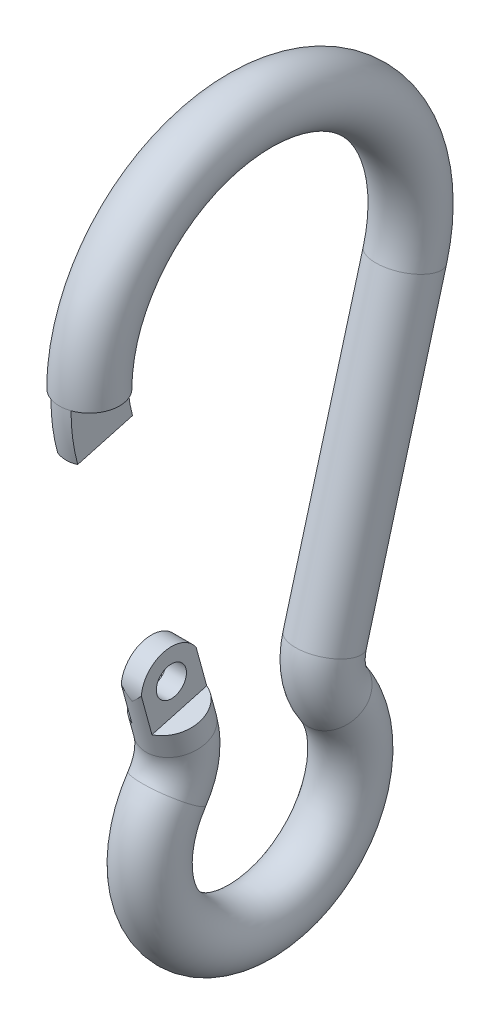
ISO-10303-21;
HEADER;
FILE_DESCRIPTION(('STEP AP214'),'2;1');
FILE_NAME('part.step','',(''),(''),'','','');
FILE_SCHEMA(('AUTOMOTIVE_DESIGN { 1 0 10303 214 1 1 1 1 }'));
ENDSEC;
DATA;
#1=APPLICATION_CONTEXT('core data for automotive mechanical design processes');
#2=APPLICATION_PROTOCOL_DEFINITION('international standard','automotive_design',2000,#1);
#3=PRODUCT_CONTEXT('',#1,'mechanical');
#4=PRODUCT('Part','Part','',(#3));
#5=PRODUCT_RELATED_PRODUCT_CATEGORY('part','',(#4));
#6=PRODUCT_DEFINITION_FORMATION('','',#4);
#7=PRODUCT_DEFINITION_CONTEXT('part definition',#1,'design');
#8=PRODUCT_DEFINITION('design','',#6,#7);
#9=PRODUCT_DEFINITION_SHAPE('','',#8);
#10=(LENGTH_UNIT() NAMED_UNIT(*) SI_UNIT(.MILLI.,.METRE.));
#11=(NAMED_UNIT(*) PLANE_ANGLE_UNIT() SI_UNIT($,.RADIAN.));
#12=(NAMED_UNIT(*) SI_UNIT($,.STERADIAN.) SOLID_ANGLE_UNIT());
#13=UNCERTAINTY_MEASURE_WITH_UNIT(LENGTH_MEASURE(1.E-05),#10,'distance_accuracy_value','');
#14=(GEOMETRIC_REPRESENTATION_CONTEXT(3) GLOBAL_UNCERTAINTY_ASSIGNED_CONTEXT((#13)) GLOBAL_UNIT_ASSIGNED_CONTEXT((#10,
#11,#12)) REPRESENTATION_CONTEXT('',''));
#15=CARTESIAN_POINT('',(0.,0.,0.));
#16=DIRECTION('',(0.,0.,1.));
#17=DIRECTION('',(1.,0.,0.));
#18=AXIS2_PLACEMENT_3D('',#15,#16,#17);
#19=CARTESIAN_POINT('',(0.,-32.3134715555648,12.2223384026015));
#20=DIRECTION('',(0.,-0.964517757676152,-0.264017982583322));
#21=DIRECTION('',(0.,0.264017982583322,-0.964517757676152));
#22=AXIS2_PLACEMENT_3D('',#19,#20,#21);
#23=CYLINDRICAL_SURFACE('',#22,3.81);
#24=CARTESIAN_POINT('',(0.,-42.4381829727151,9.45089551176788));
#25=DIRECTION('',(0.,-0.964517757676152,-0.264017982583322));
#26=DIRECTION('',(1.,0.,0.));
#27=AXIS2_PLACEMENT_3D('',#24,#25,#26);
#28=CIRCLE('',#27,3.81);
#29=CARTESIAN_POINT('',(0.,-41.4322744590727,5.77608285502173));
#30=VERTEX_POINT('',#29);
#31=EDGE_CURVE('E205',#30,#30,#28,.T.);
#32=ORIENTED_EDGE('',*,*,#31,.F.);
#33=EDGE_LOOP('',(#32));
#34=FACE_BOUND('',#33,.T.);
#35=CARTESIAN_POINT('',(0.,-35.9882842123109,11.216429888959));
#36=DIRECTION('',(-0.707106781186547,-0.68201704702765,-0.186688905839859));
#37=DIRECTION('',(0.707106781186547,-0.68201704702765,-0.186688905839859));
#38=AXIS2_PLACEMENT_3D('',#35,#36,#37);
#39=ELLIPSE('',#38,5.38815367264149,3.81);
#40=CARTESIAN_POINT('',(-1.27,-33.8149670183957,8.08708612793939));
#41=VERTEX_POINT('',#40);
#42=CARTESIAN_POINT('',(0.,-34.9823756986685,7.5416172322129));
#43=VERTEX_POINT('',#42);
#44=EDGE_CURVE('E164',#41,#43,#39,.T.);
#45=ORIENTED_EDGE('',*,*,#44,.T.);
#46=CARTESIAN_POINT('',(0.,-35.9882842123109,11.216429888959));
#47=DIRECTION('',(0.707106781186547,-0.68201704702765,-0.186688905839859));
#48=DIRECTION('',(-0.707106781186547,-0.68201704702765,-0.186688905839859));
#49=AXIS2_PLACEMENT_3D('',#46,#47,#48);
#50=ELLIPSE('',#49,5.38815367264149,3.81);
#51=CARTESIAN_POINT('',(1.27,-33.8149670183957,8.08708612793939));
#52=VERTEX_POINT('',#51);
#53=EDGE_CURVE('E161',#43,#52,#50,.T.);
#54=ORIENTED_EDGE('',*,*,#53,.T.);
#55=DIRECTION('',(0.,-0.964517757676152,-0.264017982583322));
#56=VECTOR('',#55,1.);
#57=CARTESIAN_POINT('',(1.27,-31.3650919138983,8.75769180370103));
#58=LINE('',#57,#56);
#59=CARTESIAN_POINT('',(1.27,-38.7147172273906,6.74587477641612));
#60=VERTEX_POINT('',#59);
#61=EDGE_CURVE('E236',#52,#60,#58,.T.);
#62=ORIENTED_EDGE('',*,*,#61,.T.);
#63=CARTESIAN_POINT('',(0.,-39.6630968690571,10.2105213753166));
#64=DIRECTION('',(0.,0.964517757676152,0.264017982583322));
#65=DIRECTION('',(0.,-0.264017982583322,0.964517757676152));
#66=AXIS2_PLACEMENT_3D('',#63,#64,#65);
#67=CIRCLE('',#66,3.81);
#68=CARTESIAN_POINT('',(1.27,-40.6114765107236,13.6751679742171));
#69=VERTEX_POINT('',#68);
#70=EDGE_CURVE('E238',#60,#69,#67,.F.);
#71=ORIENTED_EDGE('',*,*,#70,.T.);
#72=DIRECTION('',(0.,-0.964517757676152,-0.264017982583322));
#73=VECTOR('',#72,1.);
#74=CARTESIAN_POINT('',(1.27,-33.2618511972313,15.686985001502));
#75=LINE('',#74,#73);
#76=CARTESIAN_POINT('',(1.27,-35.7117263017287,15.0163793257403));
#77=VERTEX_POINT('',#76);
#78=EDGE_CURVE('E240',#69,#77,#75,.F.);
#79=ORIENTED_EDGE('',*,*,#78,.T.);
#80=CARTESIAN_POINT('',(0.,-35.9882842123109,11.216429888959));
#81=DIRECTION('',(0.707106781186547,-0.68201704702765,-0.186688905839859));
#82=DIRECTION('',(-0.707106781186547,-0.68201704702765,-0.186688905839859));
#83=AXIS2_PLACEMENT_3D('',#80,#81,#82);
#84=ELLIPSE('',#83,5.38815367264149,3.81);
#85=CARTESIAN_POINT('',(0.,-36.9941927259534,14.8912425457052));
#86=VERTEX_POINT('',#85);
#87=EDGE_CURVE('E181',#77,#86,#84,.T.);
#88=ORIENTED_EDGE('',*,*,#87,.T.);
#89=CARTESIAN_POINT('',(0.,-35.9882842123109,11.216429888959));
#90=DIRECTION('',(-0.707106781186547,-0.68201704702765,-0.186688905839859));
#91=DIRECTION('',(0.707106781186547,-0.68201704702765,-0.186688905839859));
#92=AXIS2_PLACEMENT_3D('',#89,#90,#91);
#93=ELLIPSE('',#92,5.38815367264149,3.81);
#94=CARTESIAN_POINT('',(-1.27,-35.7117263017287,15.0163793257403));
#95=VERTEX_POINT('',#94);
#96=EDGE_CURVE('E179',#86,#95,#93,.T.);
#97=ORIENTED_EDGE('',*,*,#96,.T.);
#98=DIRECTION('',(0.,-0.964517757676152,-0.264017982583322));
#99=VECTOR('',#98,1.);
#100=CARTESIAN_POINT('',(-1.27,-33.2618511972313,15.686985001502));
#101=LINE('',#100,#99);
#102=CARTESIAN_POINT('',(-1.27,-40.6114765107236,13.6751679742171));
#103=VERTEX_POINT('',#102);
#104=EDGE_CURVE('E105',#95,#103,#101,.T.);
#105=ORIENTED_EDGE('',*,*,#104,.T.);
#106=CARTESIAN_POINT('',(0.,-39.6630968690571,10.2105213753166));
#107=DIRECTION('',(0.,-0.964517757676152,-0.264017982583322));
#108=DIRECTION('',(0.,0.264017982583322,-0.964517757676152));
#109=AXIS2_PLACEMENT_3D('',#106,#107,#108);
#110=CIRCLE('',#109,3.81);
#111=CARTESIAN_POINT('',(-1.27,-38.7147172273906,6.74587477641612));
#112=VERTEX_POINT('',#111);
#113=EDGE_CURVE('E244',#112,#103,#110,.F.);
#114=ORIENTED_EDGE('',*,*,#113,.F.);
#115=DIRECTION('',(0.,-0.964517757676152,-0.264017982583322));
#116=VECTOR('',#115,1.);
#117=CARTESIAN_POINT('',(-1.27,-31.3650919138983,8.75769180370103));
#118=LINE('',#117,#116);
#119=EDGE_CURVE('E98',#112,#41,#118,.F.);
#120=ORIENTED_EDGE('',*,*,#119,.T.);
#121=EDGE_LOOP('',(#45,#54,#62,#71,#79,#88,#97,#105,#114,#120));
#122=FACE_BOUND('',#121,.T.);
#123=ADVANCED_FACE('F90',(#34,#122),#23,.T.);
#124=CARTESIAN_POINT('',(1.27,0.,0.));
#125=DIRECTION('',(1.,0.,0.));
#126=DIRECTION('',(0.,0.,-1.));
#127=AXIS2_PLACEMENT_3D('',#124,#125,#126);
#128=PLANE('',#127);
#129=CARTESIAN_POINT('',(1.27,-35.9882842123109,11.216429888959));
#130=DIRECTION('',(1.,0.,0.));
#131=DIRECTION('',(0.,0.,-1.));
#132=AXIS2_PLACEMENT_3D('',#129,#130,#131);
#133=CIRCLE('',#132,1.90500000000001);
#134=CARTESIAN_POINT('',(1.27,-35.9882842123109,9.31142988895903));
#135=VERTEX_POINT('',#134);
#136=EDGE_CURVE('E176',#135,#135,#133,.T.);
#137=ORIENTED_EDGE('',*,*,#136,.F.);
#138=EDGE_LOOP('',(#137));
#139=FACE_BOUND('',#138,.T.);
#140=ORIENTED_EDGE('',*,*,#61,.F.);
#141=CARTESIAN_POINT('',(1.27,-35.9882842123109,11.216429888959));
#142=DIRECTION('',(1.,0.,0.));
#143=DIRECTION('',(0.,0.,-1.));
#144=AXIS2_PLACEMENT_3D('',#141,#142,#143);
#145=CIRCLE('',#144,3.81);
#146=EDGE_CURVE('E167',#52,#77,#145,.T.);
#147=ORIENTED_EDGE('',*,*,#146,.T.);
#148=ORIENTED_EDGE('',*,*,#78,.F.);
#149=DIRECTION('',(0.,0.264017982583322,-0.964517757676152));
#150=VECTOR('',#149,1.);
#151=CARTESIAN_POINT('',(1.27,-34.2982514629639,-9.38847946066294));
#152=LINE('',#151,#150);
#153=EDGE_CURVE('E198',#69,#60,#152,.T.);
#154=ORIENTED_EDGE('',*,*,#153,.T.);
#155=EDGE_LOOP('',(#140,#147,#148,#154));
#156=FACE_BOUND('',#155,.T.);
#157=ADVANCED_FACE('F252',(#139,#156),#128,.T.);
#158=CARTESIAN_POINT('',(-1.27,0.,0.));
#159=DIRECTION('',(-1.,0.,0.));
#160=DIRECTION('',(0.,0.,-1.));
#161=AXIS2_PLACEMENT_3D('',#158,#159,#160);
#162=PLANE('',#161);
#163=CARTESIAN_POINT('',(-1.27,-35.9882842123109,11.216429888959));
#164=DIRECTION('',(-1.,0.,0.));
#165=DIRECTION('',(0.,0.,1.));
#166=AXIS2_PLACEMENT_3D('',#163,#164,#165);
#167=CIRCLE('',#166,1.90500000000001);
#168=CARTESIAN_POINT('',(-1.27,-35.9882842123109,13.121429888959));
#169=VERTEX_POINT('',#168);
#170=EDGE_CURVE('E169',#169,#169,#167,.T.);
#171=ORIENTED_EDGE('',*,*,#170,.F.);
#172=EDGE_LOOP('',(#171));
#173=FACE_BOUND('',#172,.T.);
#174=CARTESIAN_POINT('',(-1.27,-35.9882842123109,11.216429888959));
#175=DIRECTION('',(-1.,0.,0.));
#176=DIRECTION('',(0.,0.,1.));
#177=AXIS2_PLACEMENT_3D('',#174,#175,#176);
#178=CIRCLE('',#177,3.81);
#179=EDGE_CURVE('E12',#95,#41,#178,.T.);
#180=ORIENTED_EDGE('',*,*,#179,.T.);
#181=ORIENTED_EDGE('',*,*,#119,.F.);
#182=DIRECTION('',(0.,0.264017982583322,-0.964517757676152));
#183=VECTOR('',#182,1.);
#184=CARTESIAN_POINT('',(-1.27,-34.2982514629639,-9.38847946066294));
#185=LINE('',#184,#183);
#186=EDGE_CURVE('E185',#103,#112,#185,.T.);
#187=ORIENTED_EDGE('',*,*,#186,.F.);
#188=ORIENTED_EDGE('',*,*,#104,.F.);
#189=EDGE_LOOP('',(#180,#181,#187,#188));
#190=FACE_BOUND('',#189,.T.);
#191=ADVANCED_FACE('F249',(#173,#190),#162,.T.);
#192=CARTESIAN_POINT('',(0.,-5.36484540609308,19.5990008359794));
#193=DIRECTION('',(0.,-0.964517757676153,-0.264017982583321));
#194=DIRECTION('',(1.,0.,0.));
#195=AXIS2_PLACEMENT_3D('',#192,#193,#194);
#196=PLANE('',#195);
#197=CARTESIAN_POINT('',(0.,-5.36484540609308,19.5990008359794));
#198=DIRECTION('',(0.,-0.964517757676153,-0.264017982583321));
#199=DIRECTION('',(1.,0.,0.));
#200=AXIS2_PLACEMENT_3D('',#197,#198,#199);
#201=CIRCLE('',#200,3.81);
#202=CARTESIAN_POINT('',(1.27,-6.31322504775956,23.0636474348799));
#203=VERTEX_POINT('',#202);
#204=CARTESIAN_POINT('',(-1.27,-6.31322504775956,23.0636474348799));
#205=VERTEX_POINT('',#204);
#206=EDGE_CURVE('E227',#203,#205,#201,.T.);
#207=ORIENTED_EDGE('',*,*,#206,.T.);
#208=DIRECTION('',(0.,0.264017982583321,-0.964517757676153));
#209=VECTOR('',#208,1.);
#210=CARTESIAN_POINT('',(-1.27,0.,0.));
#211=LINE('',#210,#209);
#212=CARTESIAN_POINT('',(-1.27,-4.4164657644266,16.134354237079));
#213=VERTEX_POINT('',#212);
#214=EDGE_CURVE('E186',#205,#213,#211,.T.);
#215=ORIENTED_EDGE('',*,*,#214,.T.);
#216=CARTESIAN_POINT('',(1.27,-4.4164657644266,16.134354237079));
#217=VERTEX_POINT('',#216);
#218=EDGE_CURVE('E225',#213,#217,#201,.T.);
#219=ORIENTED_EDGE('',*,*,#218,.T.);
#220=DIRECTION('',(0.,0.264017982583321,-0.964517757676153));
#221=VECTOR('',#220,1.);
#222=CARTESIAN_POINT('',(1.27,0.,0.));
#223=LINE('',#222,#221);
#224=EDGE_CURVE('E202',#203,#217,#223,.T.);
#225=ORIENTED_EDGE('',*,*,#224,.F.);
#226=EDGE_LOOP('',(#207,#215,#219,#225));
#227=FACE_BOUND('',#226,.T.);
#228=ADVANCED_FACE('F92',(#227),#196,.T.);
#229=CARTESIAN_POINT('',(0.,0.,0.));
#230=DIRECTION('',(1.,0.,0.));
#231=DIRECTION('',(0.,0.,-1.));
#232=AXIS2_PLACEMENT_3D('',#229,#230,#231);
#233=TOROIDAL_SURFACE('',#232,20.32,3.81);
#234=CARTESIAN_POINT('',(0.,0.,20.32));
#235=DIRECTION('',(0.,-1.,0.));
#236=DIRECTION('',(1.,0.,0.));
#237=AXIS2_PLACEMENT_3D('',#234,#235,#236);
#238=CIRCLE('',#237,3.81);
#239=CARTESIAN_POINT('',(1.27,1.72624435325654E-13,23.9121024484277));
#240=VERTEX_POINT('',#239);
#241=CARTESIAN_POINT('',(-1.27,0.,23.9121024484277));
#242=VERTEX_POINT('',#241);
#243=EDGE_CURVE('E226',#240,#242,#238,.T.);
#244=ORIENTED_EDGE('',*,*,#243,.T.);
#245=CARTESIAN_POINT('',(-1.27,0.,0.));
#246=DIRECTION('',(-1.,0.,0.));
#247=DIRECTION('',(0.,0.,1.));
#248=AXIS2_PLACEMENT_3D('',#245,#246,#247);
#249=CIRCLE('',#248,23.9121024484277);
#250=EDGE_CURVE('E195',#242,#205,#249,.F.);
#251=ORIENTED_EDGE('',*,*,#250,.T.);
#252=ORIENTED_EDGE('',*,*,#206,.F.);
#253=CARTESIAN_POINT('',(1.27,0.,0.));
#254=DIRECTION('',(1.,0.,0.));
#255=DIRECTION('',(0.,0.,-1.));
#256=AXIS2_PLACEMENT_3D('',#253,#254,#255);
#257=CIRCLE('',#256,23.9121024484277);
#258=EDGE_CURVE('E233',#203,#240,#257,.F.);
#259=ORIENTED_EDGE('',*,*,#258,.T.);
#260=EDGE_LOOP('',(#244,#251,#252,#259));
#261=FACE_BOUND('',#260,.T.);
#262=ADVANCED_FACE('F302',(#261),#233,.T.);
#263=ORIENTED_EDGE('',*,*,#218,.F.);
#264=CARTESIAN_POINT('',(-1.27,0.,0.));
#265=DIRECTION('',(1.,0.,0.));
#266=DIRECTION('',(0.,0.,-1.));
#267=AXIS2_PLACEMENT_3D('',#264,#265,#266);
#268=CIRCLE('',#267,16.7278975515723);
#269=CARTESIAN_POINT('',(-1.27,1.13785184224361E-13,16.7278975515723));
#270=VERTEX_POINT('',#269);
#271=EDGE_CURVE('E190',#213,#270,#268,.F.);
#272=ORIENTED_EDGE('',*,*,#271,.T.);
#273=CARTESIAN_POINT('',(1.27,1.13785184224361E-13,16.7278975515723));
#274=VERTEX_POINT('',#273);
#275=EDGE_CURVE('E222',#270,#274,#238,.T.);
#276=ORIENTED_EDGE('',*,*,#275,.T.);
#277=CARTESIAN_POINT('',(1.27,0.,0.));
#278=DIRECTION('',(-1.,0.,0.));
#279=DIRECTION('',(0.,0.,1.));
#280=AXIS2_PLACEMENT_3D('',#277,#278,#279);
#281=CIRCLE('',#280,16.7278975515723);
#282=EDGE_CURVE('E230',#274,#217,#281,.F.);
#283=ORIENTED_EDGE('',*,*,#282,.T.);
#284=EDGE_LOOP('',(#263,#272,#276,#283));
#285=FACE_BOUND('',#284,.T.);
#286=ADVANCED_FACE('F286',(#285),#233,.T.);
#287=CARTESIAN_POINT('',(0.,-44.45,16.8005208252601));
#288=DIRECTION('',(-1.,0.,0.));
#289=DIRECTION('',(0.,0.,1.));
#290=AXIS2_PLACEMENT_3D('',#287,#288,#289);
#291=TOROIDAL_SURFACE('',#290,7.61999999999999,3.81);
#292=CARTESIAN_POINT('',(0.,-48.73625,10.5003255157876));
#293=DIRECTION('',(0.,-0.826797284707684,0.5625));
#294=DIRECTION('',(1.,0.,0.));
#295=AXIS2_PLACEMENT_3D('',#292,#293,#294);
#296=CIRCLE('',#295,3.81);
#297=CARTESIAN_POINT('',(0.,-50.879375,7.35022786105132));
#298=VERTEX_POINT('',#297);
#299=EDGE_CURVE('E210',#298,#298,#296,.T.);
#300=CARTESIAN_POINT('',(0.,-44.45,16.8005208252601));
#301=DIRECTION('',(-1.,0.,0.));
#302=DIRECTION('',(0.,0.,1.));
#303=AXIS2_PLACEMENT_3D('',#300,#301,#302);
#304=CIRCLE('',#303,11.43);
#305=EDGE_CURVE('',#30,#298,#304,.T.);
#306=ORIENTED_EDGE('',*,*,#31,.T.);
#307=ORIENTED_EDGE('',*,*,#299,.F.);
#308=ORIENTED_EDGE('',*,*,#305,.T.);
#309=ORIENTED_EDGE('',*,*,#305,.F.);
#310=EDGE_LOOP('',(#306,#308,#307,#309));
#311=FACE_BOUND('',#310,.T.);
#312=ADVANCED_FACE('F282',(#311),#291,.T.);
#313=CARTESIAN_POINT('',(0.,-55.88,0.));
#314=DIRECTION('',(1.,0.,0.));
#315=DIRECTION('',(0.,0.,-1.));
#316=AXIS2_PLACEMENT_3D('',#313,#314,#315);
#317=TOROIDAL_SURFACE('',#316,12.7,3.81);
#318=CARTESIAN_POINT('',(0.,-48.73625,-10.5003255157876));
#319=DIRECTION('',(0.,0.826797284707684,0.562500000000001));
#320=DIRECTION('',(1.,0.,0.));
#321=AXIS2_PLACEMENT_3D('',#318,#319,#320);
#322=CIRCLE('',#321,3.81);
#323=CARTESIAN_POINT('',(0.,-50.879375,-7.35022786105131));
#324=VERTEX_POINT('',#323);
#325=EDGE_CURVE('E213',#324,#324,#322,.T.);
#326=ORIENTED_EDGE('',*,*,#325,.F.);
#327=EDGE_LOOP('',(#326));
#328=FACE_BOUND('',#327,.T.);
#329=ORIENTED_EDGE('',*,*,#299,.T.);
#330=EDGE_LOOP('',(#329));
#331=FACE_BOUND('',#330,.T.);
#332=ADVANCED_FACE('F285',(#328,#331),#317,.T.);
#333=CARTESIAN_POINT('',(0.,-44.45,-16.8005208252601));
#334=DIRECTION('',(-1.,0.,0.));
#335=DIRECTION('',(0.,0.,1.));
#336=AXIS2_PLACEMENT_3D('',#333,#334,#335);
#337=TOROIDAL_SURFACE('',#336,7.62,3.81);
#338=CARTESIAN_POINT('',(0.,-42.4381829727151,-9.45089551176786));
#339=DIRECTION('',(0.,0.964517757676153,-0.26401798258332));
#340=DIRECTION('',(1.,0.,0.));
#341=AXIS2_PLACEMENT_3D('',#338,#339,#340);
#342=CIRCLE('',#341,3.81);
#343=CARTESIAN_POINT('',(0.,-41.4322744590726,-5.77608285502172));
#344=VERTEX_POINT('',#343);
#345=EDGE_CURVE('E216',#344,#344,#342,.T.);
#346=CARTESIAN_POINT('',(0.,-44.45,-16.8005208252601));
#347=DIRECTION('',(-1.,0.,0.));
#348=DIRECTION('',(0.,0.,1.));
#349=AXIS2_PLACEMENT_3D('',#346,#347,#348);
#350=CIRCLE('',#349,11.43);
#351=EDGE_CURVE('',#324,#344,#350,.T.);
#352=ORIENTED_EDGE('',*,*,#325,.T.);
#353=ORIENTED_EDGE('',*,*,#345,.F.);
#354=ORIENTED_EDGE('',*,*,#351,.T.);
#355=ORIENTED_EDGE('',*,*,#351,.F.);
#356=EDGE_LOOP('',(#352,#354,#353,#355));
#357=FACE_BOUND('',#356,.T.);
#358=ADVANCED_FACE('F290',(#357),#337,.T.);
#359=CARTESIAN_POINT('',(0.,-42.4381829727151,-9.45089551176786));
#360=DIRECTION('',(0.,0.964517757676153,-0.26401798258332));
#361=DIRECTION('',(0.,0.26401798258332,0.964517757676153));
#362=AXIS2_PLACEMENT_3D('',#359,#360,#361);
#363=CYLINDRICAL_SURFACE('',#362,3.81);
#364=CARTESIAN_POINT('',(0.,-5.36484540609306,-19.5990008359794));
#365=DIRECTION('',(0.,0.964517757676153,-0.26401798258332));
#366=DIRECTION('',(1.,0.,0.));
#367=AXIS2_PLACEMENT_3D('',#364,#365,#366);
#368=CIRCLE('',#367,3.81);
#369=CARTESIAN_POINT('',(3.81,-5.36484540609306,-19.5990008359794));
#370=VERTEX_POINT('',#369);
#371=EDGE_CURVE('E219',#370,#370,#368,.T.);
#372=ORIENTED_EDGE('',*,*,#371,.F.);
#373=EDGE_LOOP('',(#372));
#374=FACE_BOUND('',#373,.T.);
#375=ORIENTED_EDGE('',*,*,#345,.T.);
#376=EDGE_LOOP('',(#375));
#377=FACE_BOUND('',#376,.T.);
#378=ADVANCED_FACE('F294',(#374,#377),#363,.T.);
#379=CARTESIAN_POINT('',(0.,0.,0.));
#380=DIRECTION('',(1.,0.,0.));
#381=DIRECTION('',(0.,0.,-1.));
#382=AXIS2_PLACEMENT_3D('',#379,#380,#381);
#383=TOROIDAL_SURFACE('',#382,20.32,3.81);
#384=EDGE_CURVE('E223',#274,#240,#238,.T.);
#385=ORIENTED_EDGE('',*,*,#384,.F.);
#386=ORIENTED_EDGE('',*,*,#275,.F.);
#387=EDGE_CURVE('E315',#242,#270,#238,.T.);
#388=ORIENTED_EDGE('',*,*,#387,.F.);
#389=ORIENTED_EDGE('',*,*,#243,.F.);
#390=EDGE_LOOP('',(#385,#386,#388,#389));
#391=FACE_BOUND('',#390,.T.);
#392=ORIENTED_EDGE('',*,*,#371,.T.);
#393=EDGE_LOOP('',(#392));
#394=FACE_BOUND('',#393,.T.);
#395=ADVANCED_FACE('F298',(#391,#394),#383,.T.);
#396=CARTESIAN_POINT('',(3.81,0.,0.));
#397=DIRECTION('',(0.,1.,0.));
#398=DIRECTION('',(0.,0.,1.));
#399=AXIS2_PLACEMENT_3D('',#396,#397,#398);
#400=PLANE('',#399);
#401=DIRECTION('',(0.,0.,-1.));
#402=VECTOR('',#401,1.);
#403=CARTESIAN_POINT('',(1.27,0.,0.));
#404=LINE('',#403,#402);
#405=EDGE_CURVE('E199',#240,#274,#404,.T.);
#406=ORIENTED_EDGE('',*,*,#405,.T.);
#407=ORIENTED_EDGE('',*,*,#384,.T.);
#408=EDGE_LOOP('',(#406,#407));
#409=FACE_BOUND('',#408,.T.);
#410=ADVANCED_FACE('F268',(#409),#400,.F.);
#411=CARTESIAN_POINT('',(1.27,0.,0.));
#412=DIRECTION('',(1.,0.,0.));
#413=DIRECTION('',(0.,0.,-1.));
#414=AXIS2_PLACEMENT_3D('',#411,#412,#413);
#415=PLANE('',#414);
#416=ORIENTED_EDGE('',*,*,#224,.T.);
#417=ORIENTED_EDGE('',*,*,#282,.F.);
#418=ORIENTED_EDGE('',*,*,#405,.F.);
#419=ORIENTED_EDGE('',*,*,#258,.F.);
#420=EDGE_LOOP('',(#416,#417,#418,#419));
#421=FACE_BOUND('',#420,.T.);
#422=ADVANCED_FACE('F259',(#421),#415,.T.);
#423=CARTESIAN_POINT('',(3.81,-34.2982514629639,-9.38847946066294));
#424=DIRECTION('',(0.,0.964517757676152,0.264017982583322));
#425=DIRECTION('',(0.,-0.264017982583322,0.964517757676152));
#426=AXIS2_PLACEMENT_3D('',#423,#424,#425);
#427=PLANE('',#426);
#428=ORIENTED_EDGE('',*,*,#153,.F.);
#429=ORIENTED_EDGE('',*,*,#70,.F.);
#430=EDGE_LOOP('',(#428,#429));
#431=FACE_BOUND('',#430,.T.);
#432=ADVANCED_FACE('F256',(#431),#427,.T.);
#433=CARTESIAN_POINT('',(-3.81,0.,0.));
#434=DIRECTION('',(0.,-1.,0.));
#435=DIRECTION('',(0.,0.,-1.));
#436=AXIS2_PLACEMENT_3D('',#433,#434,#435);
#437=PLANE('',#436);
#438=DIRECTION('',(0.,0.,-1.));
#439=VECTOR('',#438,1.);
#440=CARTESIAN_POINT('',(-1.27,0.,0.));
#441=LINE('',#440,#439);
#442=EDGE_CURVE('E112',#242,#270,#441,.T.);
#443=ORIENTED_EDGE('',*,*,#442,.F.);
#444=ORIENTED_EDGE('',*,*,#387,.T.);
#445=EDGE_LOOP('',(#443,#444));
#446=FACE_BOUND('',#445,.T.);
#447=ADVANCED_FACE('F258',(#446),#437,.T.);
#448=CARTESIAN_POINT('',(-1.27,0.,0.));
#449=DIRECTION('',(-1.,0.,0.));
#450=DIRECTION('',(0.,0.,-1.));
#451=AXIS2_PLACEMENT_3D('',#448,#449,#450);
#452=PLANE('',#451);
#453=ORIENTED_EDGE('',*,*,#442,.T.);
#454=ORIENTED_EDGE('',*,*,#271,.F.);
#455=ORIENTED_EDGE('',*,*,#214,.F.);
#456=ORIENTED_EDGE('',*,*,#250,.F.);
#457=EDGE_LOOP('',(#453,#454,#455,#456));
#458=FACE_BOUND('',#457,.T.);
#459=ADVANCED_FACE('F266',(#458),#452,.T.);
#460=CARTESIAN_POINT('',(-3.81,-34.2982514629639,-9.38847946066294));
#461=DIRECTION('',(0.,-0.964517757676152,-0.264017982583322));
#462=DIRECTION('',(0.,0.264017982583322,-0.964517757676152));
#463=AXIS2_PLACEMENT_3D('',#460,#461,#462);
#464=PLANE('',#463);
#465=ORIENTED_EDGE('',*,*,#186,.T.);
#466=ORIENTED_EDGE('',*,*,#113,.T.);
#467=EDGE_LOOP('',(#465,#466));
#468=FACE_BOUND('',#467,.T.);
#469=ADVANCED_FACE('F247',(#468),#464,.F.);
#470=CARTESIAN_POINT('',(-3.81,-35.9882842123109,11.216429888959));
#471=DIRECTION('',(1.,0.,0.));
#472=DIRECTION('',(0.,0.,-1.));
#473=AXIS2_PLACEMENT_3D('',#470,#471,#472);
#474=CYLINDRICAL_SURFACE('',#473,1.90500000000001);
#475=ORIENTED_EDGE('',*,*,#136,.T.);
#476=EDGE_LOOP('',(#475));
#477=FACE_BOUND('',#476,.T.);
#478=ORIENTED_EDGE('',*,*,#170,.T.);
#479=EDGE_LOOP('',(#478));
#480=FACE_BOUND('',#479,.T.);
#481=ADVANCED_FACE('F329',(#477,#480),#474,.F.);
#482=CARTESIAN_POINT('',(-3.81,-35.9882842123109,11.216429888959));
#483=DIRECTION('',(1.,0.,0.));
#484=DIRECTION('',(0.,0.,-1.));
#485=AXIS2_PLACEMENT_3D('',#482,#483,#484);
#486=CYLINDRICAL_SURFACE('',#485,3.81);
#487=ORIENTED_EDGE('',*,*,#146,.F.);
#488=ORIENTED_EDGE('',*,*,#53,.F.);
#489=ORIENTED_EDGE('',*,*,#44,.F.);
#490=ORIENTED_EDGE('',*,*,#179,.F.);
#491=ORIENTED_EDGE('',*,*,#96,.F.);
#492=ORIENTED_EDGE('',*,*,#87,.F.);
#493=EDGE_LOOP('',(#487,#488,#489,#490,#491,#492));
#494=FACE_BOUND('',#493,.T.);
#495=ADVANCED_FACE('F163',(#494),#486,.T.);
#496=CLOSED_SHELL('',(#123,#157,#191,#228,#262,#286,#312,#332,#358,#378,#395,#410,#422,#432,
#447,#459,#469,#481,#495));
#497=MANIFOLD_SOLID_BREP('B2',#496);
#498=ADVANCED_BREP_SHAPE_REPRESENTATION('',(#18,#497),#14);
#499=SHAPE_DEFINITION_REPRESENTATION(#9,#498);
ENDSEC;
END-ISO-10303-21;
